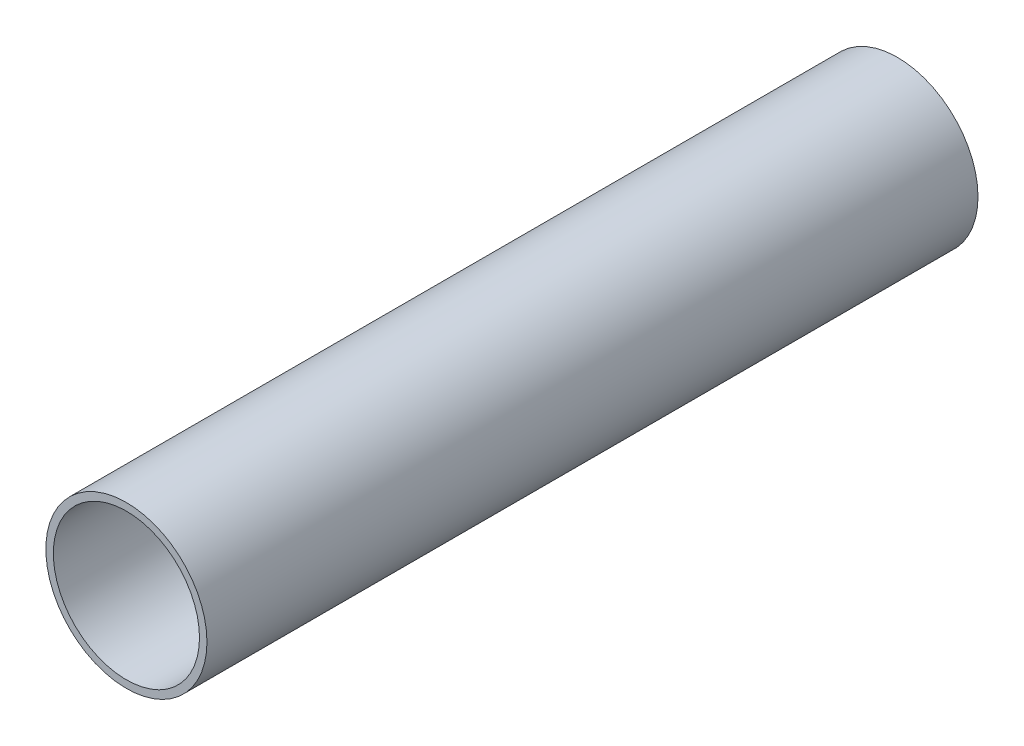
ISO-10303-21;
HEADER;
FILE_DESCRIPTION(('STEP AP214'),'2;1');
FILE_NAME('part.step','',(''),(''),'','','');
FILE_SCHEMA(('AUTOMOTIVE_DESIGN { 1 0 10303 214 1 1 1 1 }'));
ENDSEC;
DATA;
#1=APPLICATION_CONTEXT('core data for automotive mechanical design processes');
#2=APPLICATION_PROTOCOL_DEFINITION('international standard','automotive_design',2000,#1);
#3=PRODUCT_CONTEXT('',#1,'mechanical');
#4=PRODUCT('Part','Part','',(#3));
#5=PRODUCT_RELATED_PRODUCT_CATEGORY('part','',(#4));
#6=PRODUCT_DEFINITION_FORMATION('','',#4);
#7=PRODUCT_DEFINITION_CONTEXT('part definition',#1,'design');
#8=PRODUCT_DEFINITION('design','',#6,#7);
#9=PRODUCT_DEFINITION_SHAPE('','',#8);
#10=(LENGTH_UNIT() NAMED_UNIT(*) SI_UNIT(.MILLI.,.METRE.));
#11=(NAMED_UNIT(*) PLANE_ANGLE_UNIT() SI_UNIT($,.RADIAN.));
#12=(NAMED_UNIT(*) SI_UNIT($,.STERADIAN.) SOLID_ANGLE_UNIT());
#13=UNCERTAINTY_MEASURE_WITH_UNIT(LENGTH_MEASURE(1.E-05),#10,'distance_accuracy_value','');
#14=(GEOMETRIC_REPRESENTATION_CONTEXT(3) GLOBAL_UNCERTAINTY_ASSIGNED_CONTEXT((#13)) GLOBAL_UNIT_ASSIGNED_CONTEXT((#10,
#11,#12)) REPRESENTATION_CONTEXT('',''));
#15=CARTESIAN_POINT('',(0.,0.,0.));
#16=DIRECTION('',(0.,0.,1.));
#17=DIRECTION('',(1.,0.,0.));
#18=AXIS2_PLACEMENT_3D('',#15,#16,#17);
#19=CARTESIAN_POINT('',(0.,0.,134.));
#20=DIRECTION('',(0.,0.,1.));
#21=DIRECTION('',(1.,0.,0.));
#22=AXIS2_PLACEMENT_3D('',#19,#20,#21);
#23=PLANE('',#22);
#24=CARTESIAN_POINT('',(0.,0.,134.));
#25=DIRECTION('',(0.,0.,1.));
#26=DIRECTION('',(1.,0.,0.));
#27=AXIS2_PLACEMENT_3D('',#24,#25,#26);
#28=CIRCLE('',#27,14.);
#29=CARTESIAN_POINT('',(14.,0.,134.));
#30=VERTEX_POINT('',#29);
#31=EDGE_CURVE('E10',#30,#30,#28,.T.);
#32=ORIENTED_EDGE('',*,*,#31,.T.);
#33=EDGE_LOOP('',(#32));
#34=FACE_BOUND('',#33,.T.);
#35=CARTESIAN_POINT('',(0.,0.,134.));
#36=DIRECTION('',(0.,0.,1.));
#37=DIRECTION('',(1.,0.,0.));
#38=AXIS2_PLACEMENT_3D('',#35,#36,#37);
#39=CIRCLE('',#38,12.7);
#40=CARTESIAN_POINT('',(12.7,0.,134.));
#41=VERTEX_POINT('',#40);
#42=EDGE_CURVE('E49',#41,#41,#39,.T.);
#43=ORIENTED_EDGE('',*,*,#42,.F.);
#44=EDGE_LOOP('',(#43));
#45=FACE_BOUND('',#44,.T.);
#46=ADVANCED_FACE('F37',(#34,#45),#23,.T.);
#47=CARTESIAN_POINT('',(0.,0.,0.));
#48=DIRECTION('',(0.,0.,1.));
#49=DIRECTION('',(1.,0.,0.));
#50=AXIS2_PLACEMENT_3D('',#47,#48,#49);
#51=PLANE('',#50);
#52=CARTESIAN_POINT('',(0.,0.,0.));
#53=DIRECTION('',(0.,0.,1.));
#54=DIRECTION('',(1.,0.,0.));
#55=AXIS2_PLACEMENT_3D('',#52,#53,#54);
#56=CIRCLE('',#55,14.);
#57=CARTESIAN_POINT('',(14.,0.,0.));
#58=VERTEX_POINT('',#57);
#59=EDGE_CURVE('E41',#58,#58,#56,.T.);
#60=ORIENTED_EDGE('',*,*,#59,.F.);
#61=EDGE_LOOP('',(#60));
#62=FACE_BOUND('',#61,.T.);
#63=CARTESIAN_POINT('',(0.,0.,0.));
#64=DIRECTION('',(0.,0.,1.));
#65=DIRECTION('',(1.,0.,0.));
#66=AXIS2_PLACEMENT_3D('',#63,#64,#65);
#67=CIRCLE('',#66,12.7);
#68=CARTESIAN_POINT('',(12.7,0.,0.));
#69=VERTEX_POINT('',#68);
#70=EDGE_CURVE('E51',#69,#69,#67,.T.);
#71=ORIENTED_EDGE('',*,*,#70,.T.);
#72=EDGE_LOOP('',(#71));
#73=FACE_BOUND('',#72,.T.);
#74=ADVANCED_FACE('F62',(#62,#73),#51,.F.);
#75=CARTESIAN_POINT('',(0.,0.,134.));
#76=DIRECTION('',(0.,0.,-1.));
#77=DIRECTION('',(-1.,0.,0.));
#78=AXIS2_PLACEMENT_3D('',#75,#76,#77);
#79=CYLINDRICAL_SURFACE('',#78,14.);
#80=ORIENTED_EDGE('',*,*,#31,.F.);
#81=EDGE_LOOP('',(#80));
#82=FACE_BOUND('',#81,.T.);
#83=ORIENTED_EDGE('',*,*,#59,.T.);
#84=EDGE_LOOP('',(#83));
#85=FACE_BOUND('',#84,.T.);
#86=ADVANCED_FACE('F39',(#82,#85),#79,.T.);
#87=CARTESIAN_POINT('',(0.,0.,134.));
#88=DIRECTION('',(0.,0.,-1.));
#89=DIRECTION('',(-1.,0.,0.));
#90=AXIS2_PLACEMENT_3D('',#87,#88,#89);
#91=CYLINDRICAL_SURFACE('',#90,12.7);
#92=ORIENTED_EDGE('',*,*,#42,.T.);
#93=EDGE_LOOP('',(#92));
#94=FACE_BOUND('',#93,.T.);
#95=ORIENTED_EDGE('',*,*,#70,.F.);
#96=EDGE_LOOP('',(#95));
#97=FACE_BOUND('',#96,.T.);
#98=ADVANCED_FACE('F58',(#94,#97),#91,.F.);
#99=CLOSED_SHELL('',(#46,#74,#86,#98));
#100=MANIFOLD_SOLID_BREP('B2',#99);
#101=ADVANCED_BREP_SHAPE_REPRESENTATION('',(#18,#100),#14);
#102=SHAPE_DEFINITION_REPRESENTATION(#9,#101);
ENDSEC;
END-ISO-10303-21;
